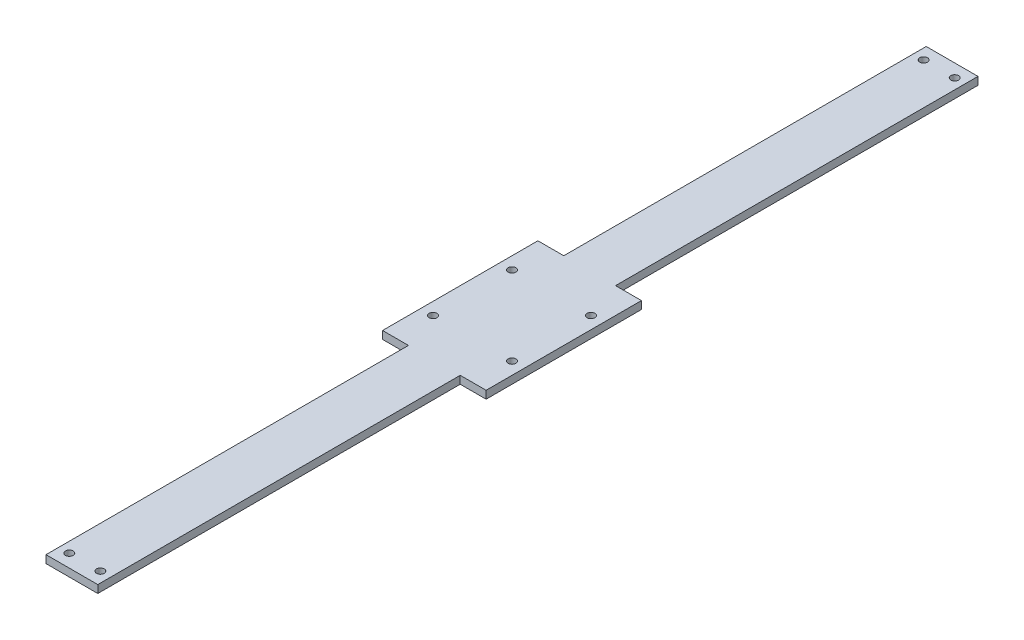
ISO-10303-21;
HEADER;
FILE_DESCRIPTION(('STEP AP214'),'2;1');
FILE_NAME('part.step','',(''),(''),'','','');
FILE_SCHEMA(('AUTOMOTIVE_DESIGN { 1 0 10303 214 1 1 1 1 }'));
ENDSEC;
DATA;
#1=APPLICATION_CONTEXT('core data for automotive mechanical design processes');
#2=APPLICATION_PROTOCOL_DEFINITION('international standard','automotive_design',2000,#1);
#3=PRODUCT_CONTEXT('',#1,'mechanical');
#4=PRODUCT('Part','Part','',(#3));
#5=PRODUCT_RELATED_PRODUCT_CATEGORY('part','',(#4));
#6=PRODUCT_DEFINITION_FORMATION('','',#4);
#7=PRODUCT_DEFINITION_CONTEXT('part definition',#1,'design');
#8=PRODUCT_DEFINITION('design','',#6,#7);
#9=PRODUCT_DEFINITION_SHAPE('','',#8);
#10=(LENGTH_UNIT() NAMED_UNIT(*) SI_UNIT(.MILLI.,.METRE.));
#11=(NAMED_UNIT(*) PLANE_ANGLE_UNIT() SI_UNIT($,.RADIAN.));
#12=(NAMED_UNIT(*) SI_UNIT($,.STERADIAN.) SOLID_ANGLE_UNIT());
#13=UNCERTAINTY_MEASURE_WITH_UNIT(LENGTH_MEASURE(1.E-05),#10,'distance_accuracy_value','');
#14=(GEOMETRIC_REPRESENTATION_CONTEXT(3) GLOBAL_UNCERTAINTY_ASSIGNED_CONTEXT((#13)) GLOBAL_UNIT_ASSIGNED_CONTEXT((#10,
#11,#12)) REPRESENTATION_CONTEXT('',''));
#15=CARTESIAN_POINT('',(0.,0.,0.));
#16=DIRECTION('',(0.,0.,1.));
#17=DIRECTION('',(1.,0.,0.));
#18=AXIS2_PLACEMENT_3D('',#15,#16,#17);
#19=CARTESIAN_POINT('',(-10.,1.5,-170.));
#20=DIRECTION('',(0.,0.,1.));
#21=DIRECTION('',(1.,0.,0.));
#22=AXIS2_PLACEMENT_3D('',#19,#20,#21);
#23=PLANE('',#22);
#24=DIRECTION('',(-1.,0.,0.));
#25=VECTOR('',#24,1.);
#26=CARTESIAN_POINT('',(-10.,-1.5,-170.));
#27=LINE('',#26,#25);
#28=CARTESIAN_POINT('',(9.99999999999997,-1.5,-170.));
#29=VERTEX_POINT('',#28);
#30=CARTESIAN_POINT('',(-10.,-1.5,-170.));
#31=VERTEX_POINT('',#30);
#32=EDGE_CURVE('E153',#29,#31,#27,.T.);
#33=ORIENTED_EDGE('',*,*,#32,.T.);
#34=DIRECTION('',(0.,-1.,0.));
#35=VECTOR('',#34,1.);
#36=CARTESIAN_POINT('',(-10.,1.5,-170.));
#37=LINE('',#36,#35);
#38=CARTESIAN_POINT('',(-10.,1.5,-170.));
#39=VERTEX_POINT('',#38);
#40=EDGE_CURVE('E11',#39,#31,#37,.T.);
#41=ORIENTED_EDGE('',*,*,#40,.F.);
#42=DIRECTION('',(-1.,0.,0.));
#43=VECTOR('',#42,1.);
#44=CARTESIAN_POINT('',(-10.,1.5,-170.));
#45=LINE('',#44,#43);
#46=CARTESIAN_POINT('',(9.99999999999997,1.5,-170.));
#47=VERTEX_POINT('',#46);
#48=EDGE_CURVE('E176',#47,#39,#45,.T.);
#49=ORIENTED_EDGE('',*,*,#48,.F.);
#50=DIRECTION('',(0.,-1.,0.));
#51=VECTOR('',#50,1.);
#52=CARTESIAN_POINT('',(9.99999999999997,1.5,-170.));
#53=LINE('',#52,#51);
#54=EDGE_CURVE('E149',#47,#29,#53,.T.);
#55=ORIENTED_EDGE('',*,*,#54,.T.);
#56=EDGE_LOOP('',(#33,#41,#49,#55));
#57=FACE_BOUND('',#56,.T.);
#58=ADVANCED_FACE('F33',(#57),#23,.F.);
#59=CARTESIAN_POINT('',(-10.,1.5,-170.));
#60=DIRECTION('',(1.,0.,0.));
#61=DIRECTION('',(0.,0.,-1.));
#62=AXIS2_PLACEMENT_3D('',#59,#60,#61);
#63=PLANE('',#62);
#64=DIRECTION('',(0.,0.,1.));
#65=VECTOR('',#64,1.);
#66=CARTESIAN_POINT('',(-10.,-1.5,-170.));
#67=LINE('',#66,#65);
#68=CARTESIAN_POINT('',(-10.,-1.5,-30.));
#69=VERTEX_POINT('',#68);
#70=EDGE_CURVE('E156',#31,#69,#67,.T.);
#71=ORIENTED_EDGE('',*,*,#70,.T.);
#72=DIRECTION('',(0.,-1.,0.));
#73=VECTOR('',#72,1.);
#74=CARTESIAN_POINT('',(-10.,1.5,-30.));
#75=LINE('',#74,#73);
#76=CARTESIAN_POINT('',(-10.,1.5,-30.));
#77=VERTEX_POINT('',#76);
#78=EDGE_CURVE('E41',#77,#69,#75,.T.);
#79=ORIENTED_EDGE('',*,*,#78,.F.);
#80=DIRECTION('',(0.,0.,1.));
#81=VECTOR('',#80,1.);
#82=CARTESIAN_POINT('',(-10.,1.5,-170.));
#83=LINE('',#82,#81);
#84=EDGE_CURVE('E104',#39,#77,#83,.T.);
#85=ORIENTED_EDGE('',*,*,#84,.F.);
#86=ORIENTED_EDGE('',*,*,#40,.T.);
#87=EDGE_LOOP('',(#71,#79,#85,#86));
#88=FACE_BOUND('',#87,.T.);
#89=ADVANCED_FACE('F256',(#88),#63,.F.);
#90=CARTESIAN_POINT('',(-10.,1.5,-30.));
#91=DIRECTION('',(0.,0.,1.));
#92=DIRECTION('',(1.,0.,0.));
#93=AXIS2_PLACEMENT_3D('',#90,#91,#92);
#94=PLANE('',#93);
#95=DIRECTION('',(-1.,0.,0.));
#96=VECTOR('',#95,1.);
#97=CARTESIAN_POINT('',(-10.,-1.5,-30.));
#98=LINE('',#97,#96);
#99=CARTESIAN_POINT('',(-20.,-1.5,-30.));
#100=VERTEX_POINT('',#99);
#101=EDGE_CURVE('E159',#69,#100,#98,.T.);
#102=ORIENTED_EDGE('',*,*,#101,.T.);
#103=DIRECTION('',(0.,-1.,0.));
#104=VECTOR('',#103,1.);
#105=CARTESIAN_POINT('',(-20.,1.5,-30.));
#106=LINE('',#105,#104);
#107=CARTESIAN_POINT('',(-20.,1.5,-30.));
#108=VERTEX_POINT('',#107);
#109=EDGE_CURVE('E195',#108,#100,#106,.T.);
#110=ORIENTED_EDGE('',*,*,#109,.F.);
#111=DIRECTION('',(-1.,0.,0.));
#112=VECTOR('',#111,1.);
#113=CARTESIAN_POINT('',(-10.,1.5,-30.));
#114=LINE('',#113,#112);
#115=EDGE_CURVE('E203',#77,#108,#114,.T.);
#116=ORIENTED_EDGE('',*,*,#115,.F.);
#117=ORIENTED_EDGE('',*,*,#78,.T.);
#118=EDGE_LOOP('',(#102,#110,#116,#117));
#119=FACE_BOUND('',#118,.T.);
#120=ADVANCED_FACE('F201',(#119),#94,.F.);
#121=CARTESIAN_POINT('',(-20.,1.5,-30.));
#122=DIRECTION('',(1.,0.,0.));
#123=DIRECTION('',(0.,0.,-1.));
#124=AXIS2_PLACEMENT_3D('',#121,#122,#123);
#125=PLANE('',#124);
#126=DIRECTION('',(0.,0.,1.));
#127=VECTOR('',#126,1.);
#128=CARTESIAN_POINT('',(-20.,-1.5,-30.));
#129=LINE('',#128,#127);
#130=CARTESIAN_POINT('',(-20.,-1.5,30.0000000000001));
#131=VERTEX_POINT('',#130);
#132=EDGE_CURVE('E161',#100,#131,#129,.T.);
#133=ORIENTED_EDGE('',*,*,#132,.T.);
#134=DIRECTION('',(0.,-1.,0.));
#135=VECTOR('',#134,1.);
#136=CARTESIAN_POINT('',(-20.,1.5,30.0000000000001));
#137=LINE('',#136,#135);
#138=CARTESIAN_POINT('',(-20.,1.5,30.0000000000001));
#139=VERTEX_POINT('',#138);
#140=EDGE_CURVE('E192',#139,#131,#137,.T.);
#141=ORIENTED_EDGE('',*,*,#140,.F.);
#142=DIRECTION('',(0.,0.,1.));
#143=VECTOR('',#142,1.);
#144=CARTESIAN_POINT('',(-20.,1.5,-30.));
#145=LINE('',#144,#143);
#146=EDGE_CURVE('E221',#108,#139,#145,.T.);
#147=ORIENTED_EDGE('',*,*,#146,.F.);
#148=ORIENTED_EDGE('',*,*,#109,.T.);
#149=EDGE_LOOP('',(#133,#141,#147,#148));
#150=FACE_BOUND('',#149,.T.);
#151=ADVANCED_FACE('F212',(#150),#125,.F.);
#152=CARTESIAN_POINT('',(-10.,1.5,30.0000000000001));
#153=DIRECTION('',(0.,0.,-1.));
#154=DIRECTION('',(-1.,0.,0.));
#155=AXIS2_PLACEMENT_3D('',#152,#153,#154);
#156=PLANE('',#155);
#157=DIRECTION('',(1.,0.,0.));
#158=VECTOR('',#157,1.);
#159=CARTESIAN_POINT('',(-10.,-1.5,30.0000000000001));
#160=LINE('',#159,#158);
#161=CARTESIAN_POINT('',(-10.,-1.5,30.0000000000001));
#162=VERTEX_POINT('',#161);
#163=EDGE_CURVE('E163',#131,#162,#160,.T.);
#164=ORIENTED_EDGE('',*,*,#163,.T.);
#165=DIRECTION('',(0.,-1.,0.));
#166=VECTOR('',#165,1.);
#167=CARTESIAN_POINT('',(-10.,1.5,30.0000000000001));
#168=LINE('',#167,#166);
#169=CARTESIAN_POINT('',(-10.,1.5,30.0000000000001));
#170=VERTEX_POINT('',#169);
#171=EDGE_CURVE('E189',#170,#162,#168,.T.);
#172=ORIENTED_EDGE('',*,*,#171,.F.);
#173=DIRECTION('',(1.,0.,0.));
#174=VECTOR('',#173,1.);
#175=CARTESIAN_POINT('',(-10.,1.5,30.0000000000001));
#176=LINE('',#175,#174);
#177=EDGE_CURVE('E218',#139,#170,#176,.T.);
#178=ORIENTED_EDGE('',*,*,#177,.F.);
#179=ORIENTED_EDGE('',*,*,#140,.T.);
#180=EDGE_LOOP('',(#164,#172,#178,#179));
#181=FACE_BOUND('',#180,.T.);
#182=ADVANCED_FACE('F216',(#181),#156,.F.);
#183=CARTESIAN_POINT('',(-10.,1.5,170.));
#184=DIRECTION('',(1.,0.,0.));
#185=DIRECTION('',(0.,0.,-1.));
#186=AXIS2_PLACEMENT_3D('',#183,#184,#185);
#187=PLANE('',#186);
#188=DIRECTION('',(0.,0.,1.));
#189=VECTOR('',#188,1.);
#190=CARTESIAN_POINT('',(-10.,-1.5,170.));
#191=LINE('',#190,#189);
#192=CARTESIAN_POINT('',(-10.,-1.5,170.));
#193=VERTEX_POINT('',#192);
#194=EDGE_CURVE('E165',#162,#193,#191,.T.);
#195=ORIENTED_EDGE('',*,*,#194,.T.);
#196=DIRECTION('',(0.,-1.,0.));
#197=VECTOR('',#196,1.);
#198=CARTESIAN_POINT('',(-10.,1.5,170.));
#199=LINE('',#198,#197);
#200=CARTESIAN_POINT('',(-10.,1.5,170.));
#201=VERTEX_POINT('',#200);
#202=EDGE_CURVE('E186',#201,#193,#199,.T.);
#203=ORIENTED_EDGE('',*,*,#202,.F.);
#204=DIRECTION('',(0.,0.,1.));
#205=VECTOR('',#204,1.);
#206=CARTESIAN_POINT('',(-10.,1.5,170.));
#207=LINE('',#206,#205);
#208=EDGE_CURVE('E220',#170,#201,#207,.T.);
#209=ORIENTED_EDGE('',*,*,#208,.F.);
#210=ORIENTED_EDGE('',*,*,#171,.T.);
#211=EDGE_LOOP('',(#195,#203,#209,#210));
#212=FACE_BOUND('',#211,.T.);
#213=ADVANCED_FACE('F269',(#212),#187,.F.);
#214=CARTESIAN_POINT('',(-10.,1.5,170.));
#215=DIRECTION('',(0.,0.,-1.));
#216=DIRECTION('',(-1.,0.,0.));
#217=AXIS2_PLACEMENT_3D('',#214,#215,#216);
#218=PLANE('',#217);
#219=DIRECTION('',(1.,0.,0.));
#220=VECTOR('',#219,1.);
#221=CARTESIAN_POINT('',(-10.,-1.5,170.));
#222=LINE('',#221,#220);
#223=CARTESIAN_POINT('',(9.99999999999997,-1.5,170.));
#224=VERTEX_POINT('',#223);
#225=EDGE_CURVE('E167',#193,#224,#222,.T.);
#226=ORIENTED_EDGE('',*,*,#225,.T.);
#227=DIRECTION('',(0.,-1.,0.));
#228=VECTOR('',#227,1.);
#229=CARTESIAN_POINT('',(9.99999999999997,1.5,170.));
#230=LINE('',#229,#228);
#231=CARTESIAN_POINT('',(9.99999999999997,1.5,170.));
#232=VERTEX_POINT('',#231);
#233=EDGE_CURVE('E183',#232,#224,#230,.T.);
#234=ORIENTED_EDGE('',*,*,#233,.F.);
#235=DIRECTION('',(1.,0.,0.));
#236=VECTOR('',#235,1.);
#237=CARTESIAN_POINT('',(-10.,1.5,170.));
#238=LINE('',#237,#236);
#239=EDGE_CURVE('E223',#201,#232,#238,.T.);
#240=ORIENTED_EDGE('',*,*,#239,.F.);
#241=ORIENTED_EDGE('',*,*,#202,.T.);
#242=EDGE_LOOP('',(#226,#234,#240,#241));
#243=FACE_BOUND('',#242,.T.);
#244=ADVANCED_FACE('F272',(#243),#218,.F.);
#245=CARTESIAN_POINT('',(9.99999999999997,1.5,170.));
#246=DIRECTION('',(-1.,0.,0.));
#247=DIRECTION('',(0.,0.,1.));
#248=AXIS2_PLACEMENT_3D('',#245,#246,#247);
#249=PLANE('',#248);
#250=DIRECTION('',(0.,0.,-1.));
#251=VECTOR('',#250,1.);
#252=CARTESIAN_POINT('',(9.99999999999997,-1.5,170.));
#253=LINE('',#252,#251);
#254=CARTESIAN_POINT('',(9.99999999999999,-1.5,30.0000000000001));
#255=VERTEX_POINT('',#254);
#256=EDGE_CURVE('E169',#224,#255,#253,.T.);
#257=ORIENTED_EDGE('',*,*,#256,.T.);
#258=DIRECTION('',(0.,-1.,0.));
#259=VECTOR('',#258,1.);
#260=CARTESIAN_POINT('',(9.99999999999999,1.5,30.0000000000001));
#261=LINE('',#260,#259);
#262=CARTESIAN_POINT('',(9.99999999999999,1.5,30.0000000000001));
#263=VERTEX_POINT('',#262);
#264=EDGE_CURVE('E180',#263,#255,#261,.T.);
#265=ORIENTED_EDGE('',*,*,#264,.F.);
#266=DIRECTION('',(0.,0.,-1.));
#267=VECTOR('',#266,1.);
#268=CARTESIAN_POINT('',(9.99999999999997,1.5,170.));
#269=LINE('',#268,#267);
#270=EDGE_CURVE('E229',#232,#263,#269,.T.);
#271=ORIENTED_EDGE('',*,*,#270,.F.);
#272=ORIENTED_EDGE('',*,*,#233,.T.);
#273=EDGE_LOOP('',(#257,#265,#271,#272));
#274=FACE_BOUND('',#273,.T.);
#275=ADVANCED_FACE('F235',(#274),#249,.F.);
#276=CARTESIAN_POINT('',(9.99999999999999,1.5,30.0000000000001));
#277=DIRECTION('',(0.,0.,-1.));
#278=DIRECTION('',(-1.,0.,0.));
#279=AXIS2_PLACEMENT_3D('',#276,#277,#278);
#280=PLANE('',#279);
#281=DIRECTION('',(1.,0.,0.));
#282=VECTOR('',#281,1.);
#283=CARTESIAN_POINT('',(9.99999999999999,-1.5,30.0000000000001));
#284=LINE('',#283,#282);
#285=CARTESIAN_POINT('',(20.,-1.5,30.0000000000001));
#286=VERTEX_POINT('',#285);
#287=EDGE_CURVE('E171',#255,#286,#284,.T.);
#288=ORIENTED_EDGE('',*,*,#287,.T.);
#289=DIRECTION('',(0.,-1.,0.));
#290=VECTOR('',#289,1.);
#291=CARTESIAN_POINT('',(20.,1.5,30.0000000000001));
#292=LINE('',#291,#290);
#293=CARTESIAN_POINT('',(20.,1.5,30.0000000000001));
#294=VERTEX_POINT('',#293);
#295=EDGE_CURVE('E144',#294,#286,#292,.T.);
#296=ORIENTED_EDGE('',*,*,#295,.F.);
#297=DIRECTION('',(1.,0.,0.));
#298=VECTOR('',#297,1.);
#299=CARTESIAN_POINT('',(9.99999999999999,1.5,30.0000000000001));
#300=LINE('',#299,#298);
#301=EDGE_CURVE('E135',#263,#294,#300,.T.);
#302=ORIENTED_EDGE('',*,*,#301,.F.);
#303=ORIENTED_EDGE('',*,*,#264,.T.);
#304=EDGE_LOOP('',(#288,#296,#302,#303));
#305=FACE_BOUND('',#304,.T.);
#306=ADVANCED_FACE('F239',(#305),#280,.F.);
#307=CARTESIAN_POINT('',(20.,1.5,-30.));
#308=DIRECTION('',(-1.,0.,0.));
#309=DIRECTION('',(0.,0.,1.));
#310=AXIS2_PLACEMENT_3D('',#307,#308,#309);
#311=PLANE('',#310);
#312=DIRECTION('',(0.,0.,-1.));
#313=VECTOR('',#312,1.);
#314=CARTESIAN_POINT('',(20.,-1.5,-30.));
#315=LINE('',#314,#313);
#316=CARTESIAN_POINT('',(20.,-1.5,-30.));
#317=VERTEX_POINT('',#316);
#318=EDGE_CURVE('E143',#286,#317,#315,.T.);
#319=ORIENTED_EDGE('',*,*,#318,.T.);
#320=DIRECTION('',(0.,-1.,0.));
#321=VECTOR('',#320,1.);
#322=CARTESIAN_POINT('',(20.,1.5,-30.));
#323=LINE('',#322,#321);
#324=CARTESIAN_POINT('',(20.,1.5,-30.));
#325=VERTEX_POINT('',#324);
#326=EDGE_CURVE('E140',#325,#317,#323,.T.);
#327=ORIENTED_EDGE('',*,*,#326,.F.);
#328=DIRECTION('',(0.,0.,-1.));
#329=VECTOR('',#328,1.);
#330=CARTESIAN_POINT('',(20.,1.5,-30.));
#331=LINE('',#330,#329);
#332=EDGE_CURVE('E129',#294,#325,#331,.T.);
#333=ORIENTED_EDGE('',*,*,#332,.F.);
#334=ORIENTED_EDGE('',*,*,#295,.T.);
#335=EDGE_LOOP('',(#319,#327,#333,#334));
#336=FACE_BOUND('',#335,.T.);
#337=ADVANCED_FACE('F141',(#336),#311,.F.);
#338=CARTESIAN_POINT('',(9.99999999999999,1.5,-30.));
#339=DIRECTION('',(0.,0.,1.));
#340=DIRECTION('',(1.,0.,0.));
#341=AXIS2_PLACEMENT_3D('',#338,#339,#340);
#342=PLANE('',#341);
#343=DIRECTION('',(-1.,0.,0.));
#344=VECTOR('',#343,1.);
#345=CARTESIAN_POINT('',(9.99999999999999,-1.5,-30.));
#346=LINE('',#345,#344);
#347=CARTESIAN_POINT('',(9.99999999999999,-1.5,-30.));
#348=VERTEX_POINT('',#347);
#349=EDGE_CURVE('E90',#317,#348,#346,.T.);
#350=ORIENTED_EDGE('',*,*,#349,.T.);
#351=DIRECTION('',(0.,-1.,0.));
#352=VECTOR('',#351,1.);
#353=CARTESIAN_POINT('',(9.99999999999999,1.5,-30.));
#354=LINE('',#353,#352);
#355=CARTESIAN_POINT('',(9.99999999999999,1.5,-30.));
#356=VERTEX_POINT('',#355);
#357=EDGE_CURVE('E145',#356,#348,#354,.T.);
#358=ORIENTED_EDGE('',*,*,#357,.F.);
#359=DIRECTION('',(-1.,0.,0.));
#360=VECTOR('',#359,1.);
#361=CARTESIAN_POINT('',(9.99999999999999,1.5,-30.));
#362=LINE('',#361,#360);
#363=EDGE_CURVE('E133',#325,#356,#362,.T.);
#364=ORIENTED_EDGE('',*,*,#363,.F.);
#365=ORIENTED_EDGE('',*,*,#326,.T.);
#366=EDGE_LOOP('',(#350,#358,#364,#365));
#367=FACE_BOUND('',#366,.T.);
#368=ADVANCED_FACE('F147',(#367),#342,.F.);
#369=CARTESIAN_POINT('',(9.99999999999997,1.5,-170.));
#370=DIRECTION('',(-1.,0.,0.));
#371=DIRECTION('',(0.,0.,1.));
#372=AXIS2_PLACEMENT_3D('',#369,#370,#371);
#373=PLANE('',#372);
#374=DIRECTION('',(0.,0.,-1.));
#375=VECTOR('',#374,1.);
#376=CARTESIAN_POINT('',(9.99999999999997,-1.5,-170.));
#377=LINE('',#376,#375);
#378=EDGE_CURVE('E96',#348,#29,#377,.T.);
#379=ORIENTED_EDGE('',*,*,#378,.T.);
#380=ORIENTED_EDGE('',*,*,#54,.F.);
#381=DIRECTION('',(0.,0.,-1.));
#382=VECTOR('',#381,1.);
#383=CARTESIAN_POINT('',(9.99999999999997,1.5,-170.));
#384=LINE('',#383,#382);
#385=EDGE_CURVE('E49',#356,#47,#384,.T.);
#386=ORIENTED_EDGE('',*,*,#385,.F.);
#387=ORIENTED_EDGE('',*,*,#357,.T.);
#388=EDGE_LOOP('',(#379,#380,#386,#387));
#389=FACE_BOUND('',#388,.T.);
#390=ADVANCED_FACE('F243',(#389),#373,.F.);
#391=CARTESIAN_POINT('',(0.,1.5,0.));
#392=DIRECTION('',(0.,-1.,0.));
#393=DIRECTION('',(0.,0.,-1.));
#394=AXIS2_PLACEMENT_3D('',#391,#392,#393);
#395=PLANE('',#394);
#396=CARTESIAN_POINT('',(-5.99999999999884,1.5,165.));
#397=DIRECTION('',(0.,1.,0.));
#398=DIRECTION('',(0.,0.,1.));
#399=AXIS2_PLACEMENT_3D('',#396,#397,#398);
#400=CIRCLE('',#399,1.5);
#401=CARTESIAN_POINT('',(-5.99999999999884,1.5,166.5));
#402=VERTEX_POINT('',#401);
#403=EDGE_CURVE('E393',#402,#402,#400,.T.);
#404=ORIENTED_EDGE('',*,*,#403,.F.);
#405=EDGE_LOOP('',(#404));
#406=FACE_BOUND('',#405,.T.);
#407=CARTESIAN_POINT('',(6.00000000000116,1.5,165.));
#408=DIRECTION('',(0.,1.,0.));
#409=DIRECTION('',(0.,0.,1.));
#410=AXIS2_PLACEMENT_3D('',#407,#408,#409);
#411=CIRCLE('',#410,1.5);
#412=CARTESIAN_POINT('',(6.00000000000116,1.5,166.5));
#413=VERTEX_POINT('',#412);
#414=EDGE_CURVE('E395',#413,#413,#411,.T.);
#415=ORIENTED_EDGE('',*,*,#414,.F.);
#416=EDGE_LOOP('',(#415));
#417=FACE_BOUND('',#416,.T.);
#418=CARTESIAN_POINT('',(-6.00000000000001,1.5,-165.));
#419=DIRECTION('',(0.,1.,0.));
#420=DIRECTION('',(0.,0.,1.));
#421=AXIS2_PLACEMENT_3D('',#418,#419,#420);
#422=CIRCLE('',#421,1.5);
#423=CARTESIAN_POINT('',(-6.00000000000001,1.5,-163.5));
#424=VERTEX_POINT('',#423);
#425=EDGE_CURVE('E403',#424,#424,#422,.T.);
#426=ORIENTED_EDGE('',*,*,#425,.F.);
#427=EDGE_LOOP('',(#426));
#428=FACE_BOUND('',#427,.T.);
#429=CARTESIAN_POINT('',(5.99999999999999,1.5,-165.));
#430=DIRECTION('',(0.,1.,0.));
#431=DIRECTION('',(0.,0.,1.));
#432=AXIS2_PLACEMENT_3D('',#429,#430,#431);
#433=CIRCLE('',#432,1.5);
#434=CARTESIAN_POINT('',(5.99999999999999,1.5,-163.5));
#435=VERTEX_POINT('',#434);
#436=EDGE_CURVE('E409',#435,#435,#433,.T.);
#437=ORIENTED_EDGE('',*,*,#436,.F.);
#438=EDGE_LOOP('',(#437));
#439=FACE_BOUND('',#438,.T.);
#440=CARTESIAN_POINT('',(-15.25,1.5,-15.25));
#441=DIRECTION('',(0.,1.,0.));
#442=DIRECTION('',(0.,0.,1.));
#443=AXIS2_PLACEMENT_3D('',#440,#441,#442);
#444=CIRCLE('',#443,1.5);
#445=CARTESIAN_POINT('',(-15.25,1.5,-13.75));
#446=VERTEX_POINT('',#445);
#447=EDGE_CURVE('E415',#446,#446,#444,.T.);
#448=ORIENTED_EDGE('',*,*,#447,.F.);
#449=EDGE_LOOP('',(#448));
#450=FACE_BOUND('',#449,.T.);
#451=CARTESIAN_POINT('',(15.25,1.5,-15.25));
#452=DIRECTION('',(0.,1.,0.));
#453=DIRECTION('',(0.,0.,1.));
#454=AXIS2_PLACEMENT_3D('',#451,#452,#453);
#455=CIRCLE('',#454,1.5);
#456=CARTESIAN_POINT('',(15.25,1.5,-13.75));
#457=VERTEX_POINT('',#456);
#458=EDGE_CURVE('E421',#457,#457,#455,.T.);
#459=ORIENTED_EDGE('',*,*,#458,.F.);
#460=EDGE_LOOP('',(#459));
#461=FACE_BOUND('',#460,.T.);
#462=CARTESIAN_POINT('',(15.25,1.5,15.25));
#463=DIRECTION('',(0.,1.,0.));
#464=DIRECTION('',(0.,0.,1.));
#465=AXIS2_PLACEMENT_3D('',#462,#463,#464);
#466=CIRCLE('',#465,1.5);
#467=CARTESIAN_POINT('',(15.25,1.5,16.75));
#468=VERTEX_POINT('',#467);
#469=EDGE_CURVE('E427',#468,#468,#466,.T.);
#470=ORIENTED_EDGE('',*,*,#469,.F.);
#471=EDGE_LOOP('',(#470));
#472=FACE_BOUND('',#471,.T.);
#473=CARTESIAN_POINT('',(-15.25,1.5,15.25));
#474=DIRECTION('',(0.,1.,0.));
#475=DIRECTION('',(0.,0.,1.));
#476=AXIS2_PLACEMENT_3D('',#473,#474,#475);
#477=CIRCLE('',#476,1.5);
#478=CARTESIAN_POINT('',(-15.25,1.5,16.75));
#479=VERTEX_POINT('',#478);
#480=EDGE_CURVE('E433',#479,#479,#477,.T.);
#481=ORIENTED_EDGE('',*,*,#480,.F.);
#482=EDGE_LOOP('',(#481));
#483=FACE_BOUND('',#482,.T.);
#484=ORIENTED_EDGE('',*,*,#48,.T.);
#485=ORIENTED_EDGE('',*,*,#84,.T.);
#486=ORIENTED_EDGE('',*,*,#115,.T.);
#487=ORIENTED_EDGE('',*,*,#146,.T.);
#488=ORIENTED_EDGE('',*,*,#177,.T.);
#489=ORIENTED_EDGE('',*,*,#208,.T.);
#490=ORIENTED_EDGE('',*,*,#239,.T.);
#491=ORIENTED_EDGE('',*,*,#270,.T.);
#492=ORIENTED_EDGE('',*,*,#301,.T.);
#493=ORIENTED_EDGE('',*,*,#332,.T.);
#494=ORIENTED_EDGE('',*,*,#363,.T.);
#495=ORIENTED_EDGE('',*,*,#385,.T.);
#496=EDGE_LOOP('',(#484,#485,#486,#487,#488,#489,#490,#491,#492,#493,#494,#495));
#497=FACE_BOUND('',#496,.T.);
#498=ADVANCED_FACE('F131',(#406,#417,#428,#439,#450,#461,#472,#483,#497),#395,.F.);
#499=CARTESIAN_POINT('',(0.,-1.5,0.));
#500=DIRECTION('',(0.,-1.,0.));
#501=DIRECTION('',(0.,0.,-1.));
#502=AXIS2_PLACEMENT_3D('',#499,#500,#501);
#503=PLANE('',#502);
#504=CARTESIAN_POINT('',(-5.99999999999884,-1.5,165.));
#505=DIRECTION('',(0.,1.,0.));
#506=DIRECTION('',(0.,0.,1.));
#507=AXIS2_PLACEMENT_3D('',#504,#505,#506);
#508=CIRCLE('',#507,1.5);
#509=CARTESIAN_POINT('',(-5.99999999999884,-1.5,166.5));
#510=VERTEX_POINT('',#509);
#511=EDGE_CURVE('E390',#510,#510,#508,.T.);
#512=ORIENTED_EDGE('',*,*,#511,.T.);
#513=EDGE_LOOP('',(#512));
#514=FACE_BOUND('',#513,.T.);
#515=CARTESIAN_POINT('',(6.00000000000116,-1.5,165.));
#516=DIRECTION('',(0.,1.,0.));
#517=DIRECTION('',(0.,0.,1.));
#518=AXIS2_PLACEMENT_3D('',#515,#516,#517);
#519=CIRCLE('',#518,1.5);
#520=CARTESIAN_POINT('',(6.00000000000116,-1.5,166.5));
#521=VERTEX_POINT('',#520);
#522=EDGE_CURVE('E400',#521,#521,#519,.T.);
#523=ORIENTED_EDGE('',*,*,#522,.T.);
#524=EDGE_LOOP('',(#523));
#525=FACE_BOUND('',#524,.T.);
#526=CARTESIAN_POINT('',(-6.00000000000001,-1.5,-165.));
#527=DIRECTION('',(0.,1.,0.));
#528=DIRECTION('',(0.,0.,1.));
#529=AXIS2_PLACEMENT_3D('',#526,#527,#528);
#530=CIRCLE('',#529,1.5);
#531=CARTESIAN_POINT('',(-6.00000000000001,-1.5,-163.5));
#532=VERTEX_POINT('',#531);
#533=EDGE_CURVE('E406',#532,#532,#530,.T.);
#534=ORIENTED_EDGE('',*,*,#533,.T.);
#535=EDGE_LOOP('',(#534));
#536=FACE_BOUND('',#535,.T.);
#537=CARTESIAN_POINT('',(5.99999999999999,-1.5,-165.));
#538=DIRECTION('',(0.,1.,0.));
#539=DIRECTION('',(0.,0.,1.));
#540=AXIS2_PLACEMENT_3D('',#537,#538,#539);
#541=CIRCLE('',#540,1.5);
#542=CARTESIAN_POINT('',(5.99999999999999,-1.5,-163.5));
#543=VERTEX_POINT('',#542);
#544=EDGE_CURVE('E412',#543,#543,#541,.T.);
#545=ORIENTED_EDGE('',*,*,#544,.T.);
#546=EDGE_LOOP('',(#545));
#547=FACE_BOUND('',#546,.T.);
#548=CARTESIAN_POINT('',(-15.25,-1.5,-15.25));
#549=DIRECTION('',(0.,1.,0.));
#550=DIRECTION('',(0.,0.,1.));
#551=AXIS2_PLACEMENT_3D('',#548,#549,#550);
#552=CIRCLE('',#551,1.5);
#553=CARTESIAN_POINT('',(-15.25,-1.5,-13.75));
#554=VERTEX_POINT('',#553);
#555=EDGE_CURVE('E418',#554,#554,#552,.T.);
#556=ORIENTED_EDGE('',*,*,#555,.T.);
#557=EDGE_LOOP('',(#556));
#558=FACE_BOUND('',#557,.T.);
#559=CARTESIAN_POINT('',(15.25,-1.5,-15.25));
#560=DIRECTION('',(0.,1.,0.));
#561=DIRECTION('',(0.,0.,1.));
#562=AXIS2_PLACEMENT_3D('',#559,#560,#561);
#563=CIRCLE('',#562,1.5);
#564=CARTESIAN_POINT('',(15.25,-1.5,-13.75));
#565=VERTEX_POINT('',#564);
#566=EDGE_CURVE('E424',#565,#565,#563,.T.);
#567=ORIENTED_EDGE('',*,*,#566,.T.);
#568=EDGE_LOOP('',(#567));
#569=FACE_BOUND('',#568,.T.);
#570=CARTESIAN_POINT('',(15.25,-1.5,15.25));
#571=DIRECTION('',(0.,1.,0.));
#572=DIRECTION('',(0.,0.,1.));
#573=AXIS2_PLACEMENT_3D('',#570,#571,#572);
#574=CIRCLE('',#573,1.5);
#575=CARTESIAN_POINT('',(15.25,-1.5,16.75));
#576=VERTEX_POINT('',#575);
#577=EDGE_CURVE('E430',#576,#576,#574,.T.);
#578=ORIENTED_EDGE('',*,*,#577,.T.);
#579=EDGE_LOOP('',(#578));
#580=FACE_BOUND('',#579,.T.);
#581=CARTESIAN_POINT('',(-15.25,-1.5,15.25));
#582=DIRECTION('',(0.,1.,0.));
#583=DIRECTION('',(0.,0.,1.));
#584=AXIS2_PLACEMENT_3D('',#581,#582,#583);
#585=CIRCLE('',#584,1.5);
#586=CARTESIAN_POINT('',(-15.25,-1.5,16.75));
#587=VERTEX_POINT('',#586);
#588=EDGE_CURVE('E157',#587,#587,#585,.T.);
#589=ORIENTED_EDGE('',*,*,#588,.T.);
#590=EDGE_LOOP('',(#589));
#591=FACE_BOUND('',#590,.T.);
#592=ORIENTED_EDGE('',*,*,#32,.F.);
#593=ORIENTED_EDGE('',*,*,#378,.F.);
#594=ORIENTED_EDGE('',*,*,#349,.F.);
#595=ORIENTED_EDGE('',*,*,#318,.F.);
#596=ORIENTED_EDGE('',*,*,#287,.F.);
#597=ORIENTED_EDGE('',*,*,#256,.F.);
#598=ORIENTED_EDGE('',*,*,#225,.F.);
#599=ORIENTED_EDGE('',*,*,#194,.F.);
#600=ORIENTED_EDGE('',*,*,#163,.F.);
#601=ORIENTED_EDGE('',*,*,#132,.F.);
#602=ORIENTED_EDGE('',*,*,#101,.F.);
#603=ORIENTED_EDGE('',*,*,#70,.F.);
#604=EDGE_LOOP('',(#592,#593,#594,#595,#596,#597,#598,#599,#600,#601,#602,#603));
#605=FACE_BOUND('',#604,.T.);
#606=ADVANCED_FACE('F207',(#514,#525,#536,#547,#558,#569,#580,#591,#605),#503,.T.);
#607=CARTESIAN_POINT('',(-15.25,1.5,15.25));
#608=DIRECTION('',(0.,1.,0.));
#609=DIRECTION('',(0.,0.,1.));
#610=AXIS2_PLACEMENT_3D('',#607,#608,#609);
#611=CYLINDRICAL_SURFACE('',#610,1.5);
#612=ORIENTED_EDGE('',*,*,#588,.F.);
#613=EDGE_LOOP('',(#612));
#614=FACE_BOUND('',#613,.T.);
#615=ORIENTED_EDGE('',*,*,#480,.T.);
#616=EDGE_LOOP('',(#615));
#617=FACE_BOUND('',#616,.T.);
#618=ADVANCED_FACE('F300',(#614,#617),#611,.F.);
#619=CARTESIAN_POINT('',(15.25,1.5,15.25));
#620=DIRECTION('',(0.,1.,0.));
#621=DIRECTION('',(0.,0.,1.));
#622=AXIS2_PLACEMENT_3D('',#619,#620,#621);
#623=CYLINDRICAL_SURFACE('',#622,1.5);
#624=ORIENTED_EDGE('',*,*,#577,.F.);
#625=EDGE_LOOP('',(#624));
#626=FACE_BOUND('',#625,.T.);
#627=ORIENTED_EDGE('',*,*,#469,.T.);
#628=EDGE_LOOP('',(#627));
#629=FACE_BOUND('',#628,.T.);
#630=ADVANCED_FACE('F305',(#626,#629),#623,.F.);
#631=CARTESIAN_POINT('',(15.25,1.5,-15.25));
#632=DIRECTION('',(0.,1.,0.));
#633=DIRECTION('',(0.,0.,1.));
#634=AXIS2_PLACEMENT_3D('',#631,#632,#633);
#635=CYLINDRICAL_SURFACE('',#634,1.5);
#636=ORIENTED_EDGE('',*,*,#566,.F.);
#637=EDGE_LOOP('',(#636));
#638=FACE_BOUND('',#637,.T.);
#639=ORIENTED_EDGE('',*,*,#458,.T.);
#640=EDGE_LOOP('',(#639));
#641=FACE_BOUND('',#640,.T.);
#642=ADVANCED_FACE('F317',(#638,#641),#635,.F.);
#643=CARTESIAN_POINT('',(-15.25,1.5,-15.25));
#644=DIRECTION('',(0.,1.,0.));
#645=DIRECTION('',(0.,0.,1.));
#646=AXIS2_PLACEMENT_3D('',#643,#644,#645);
#647=CYLINDRICAL_SURFACE('',#646,1.5);
#648=ORIENTED_EDGE('',*,*,#555,.F.);
#649=EDGE_LOOP('',(#648));
#650=FACE_BOUND('',#649,.T.);
#651=ORIENTED_EDGE('',*,*,#447,.T.);
#652=EDGE_LOOP('',(#651));
#653=FACE_BOUND('',#652,.T.);
#654=ADVANCED_FACE('F327',(#650,#653),#647,.F.);
#655=CARTESIAN_POINT('',(5.99999999999999,1.5,-165.));
#656=DIRECTION('',(0.,1.,0.));
#657=DIRECTION('',(0.,0.,1.));
#658=AXIS2_PLACEMENT_3D('',#655,#656,#657);
#659=CYLINDRICAL_SURFACE('',#658,1.5);
#660=ORIENTED_EDGE('',*,*,#544,.F.);
#661=EDGE_LOOP('',(#660));
#662=FACE_BOUND('',#661,.T.);
#663=ORIENTED_EDGE('',*,*,#436,.T.);
#664=EDGE_LOOP('',(#663));
#665=FACE_BOUND('',#664,.T.);
#666=ADVANCED_FACE('F336',(#662,#665),#659,.F.);
#667=CARTESIAN_POINT('',(-6.00000000000001,1.5,-165.));
#668=DIRECTION('',(0.,1.,0.));
#669=DIRECTION('',(0.,0.,1.));
#670=AXIS2_PLACEMENT_3D('',#667,#668,#669);
#671=CYLINDRICAL_SURFACE('',#670,1.5);
#672=ORIENTED_EDGE('',*,*,#533,.F.);
#673=EDGE_LOOP('',(#672));
#674=FACE_BOUND('',#673,.T.);
#675=ORIENTED_EDGE('',*,*,#425,.T.);
#676=EDGE_LOOP('',(#675));
#677=FACE_BOUND('',#676,.T.);
#678=ADVANCED_FACE('F353',(#674,#677),#671,.F.);
#679=CARTESIAN_POINT('',(6.00000000000116,1.5,165.));
#680=DIRECTION('',(0.,1.,0.));
#681=DIRECTION('',(0.,0.,1.));
#682=AXIS2_PLACEMENT_3D('',#679,#680,#681);
#683=CYLINDRICAL_SURFACE('',#682,1.5);
#684=ORIENTED_EDGE('',*,*,#522,.F.);
#685=EDGE_LOOP('',(#684));
#686=FACE_BOUND('',#685,.T.);
#687=ORIENTED_EDGE('',*,*,#414,.T.);
#688=EDGE_LOOP('',(#687));
#689=FACE_BOUND('',#688,.T.);
#690=ADVANCED_FACE('F363',(#686,#689),#683,.F.);
#691=CARTESIAN_POINT('',(-5.99999999999884,1.5,165.));
#692=DIRECTION('',(0.,1.,0.));
#693=DIRECTION('',(0.,0.,1.));
#694=AXIS2_PLACEMENT_3D('',#691,#692,#693);
#695=CYLINDRICAL_SURFACE('',#694,1.5);
#696=ORIENTED_EDGE('',*,*,#511,.F.);
#697=EDGE_LOOP('',(#696));
#698=FACE_BOUND('',#697,.T.);
#699=ORIENTED_EDGE('',*,*,#403,.T.);
#700=EDGE_LOOP('',(#699));
#701=FACE_BOUND('',#700,.T.);
#702=ADVANCED_FACE('F373',(#698,#701),#695,.F.);
#703=CLOSED_SHELL('',(#58,#89,#120,#151,#182,#213,#244,#275,#306,#337,#368,#390,#498,#606,#618,
#630,#642,#654,#666,#678,#690,#702));
#704=MANIFOLD_SOLID_BREP('B2',#703);
#705=ADVANCED_BREP_SHAPE_REPRESENTATION('',(#18,#704),#14);
#706=SHAPE_DEFINITION_REPRESENTATION(#9,#705);
ENDSEC;
END-ISO-10303-21;
